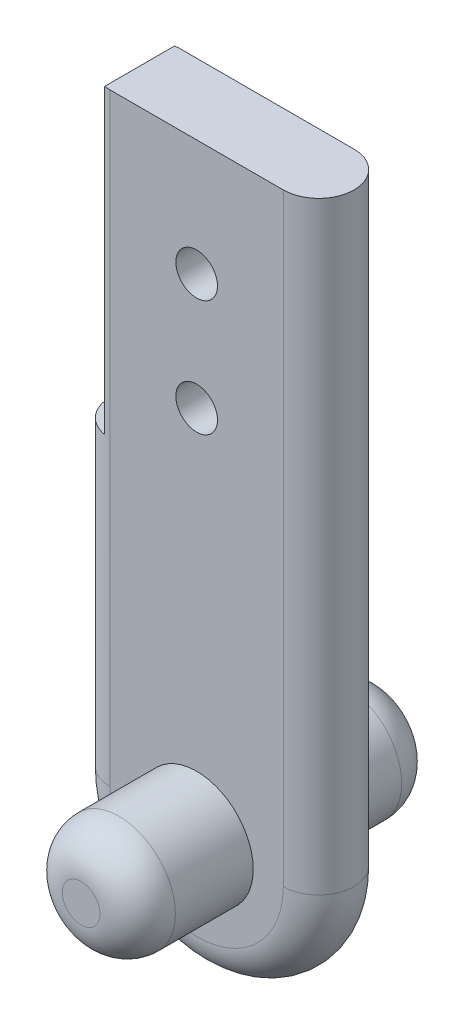
ISO-10303-21;
HEADER;
FILE_DESCRIPTION(('STEP AP214'),'2;1');
FILE_NAME('part.step','',(''),(''),'','','');
FILE_SCHEMA(('AUTOMOTIVE_DESIGN { 1 0 10303 214 1 1 1 1 }'));
ENDSEC;
DATA;
#1=APPLICATION_CONTEXT('core data for automotive mechanical design processes');
#2=APPLICATION_PROTOCOL_DEFINITION('international standard','automotive_design',2000,#1);
#3=PRODUCT_CONTEXT('',#1,'mechanical');
#4=PRODUCT('Part','Part','',(#3));
#5=PRODUCT_RELATED_PRODUCT_CATEGORY('part','',(#4));
#6=PRODUCT_DEFINITION_FORMATION('','',#4);
#7=PRODUCT_DEFINITION_CONTEXT('part definition',#1,'design');
#8=PRODUCT_DEFINITION('design','',#6,#7);
#9=PRODUCT_DEFINITION_SHAPE('','',#8);
#10=(LENGTH_UNIT() NAMED_UNIT(*) SI_UNIT(.MILLI.,.METRE.));
#11=(NAMED_UNIT(*) PLANE_ANGLE_UNIT() SI_UNIT($,.RADIAN.));
#12=(NAMED_UNIT(*) SI_UNIT($,.STERADIAN.) SOLID_ANGLE_UNIT());
#13=UNCERTAINTY_MEASURE_WITH_UNIT(LENGTH_MEASURE(1.E-05),#10,'distance_accuracy_value','');
#14=(GEOMETRIC_REPRESENTATION_CONTEXT(3) GLOBAL_UNCERTAINTY_ASSIGNED_CONTEXT((#13)) GLOBAL_UNIT_ASSIGNED_CONTEXT((#10,
#11,#12)) REPRESENTATION_CONTEXT('',''));
#15=CARTESIAN_POINT('',(0.,0.,0.));
#16=DIRECTION('',(0.,0.,1.));
#17=DIRECTION('',(1.,0.,0.));
#18=AXIS2_PLACEMENT_3D('',#15,#16,#17);
#19=CARTESIAN_POINT('',(44.846875,0.,0.));
#20=DIRECTION('',(0.,0.,1.));
#21=DIRECTION('',(1.,0.,0.));
#22=AXIS2_PLACEMENT_3D('',#19,#20,#21);
#23=TOROIDAL_SURFACE('',#22,7.29795332856184,2.9765625);
#24=CARTESIAN_POINT('',(52.1448283285618,0.,0.));
#25=DIRECTION('',(0.,1.,0.));
#26=DIRECTION('',(0.,0.,1.));
#27=AXIS2_PLACEMENT_3D('',#24,#25,#26);
#28=CIRCLE('',#27,2.9765625);
#29=CARTESIAN_POINT('',(52.1448283285618,0.,2.9765625));
#30=VERTEX_POINT('',#29);
#31=CARTESIAN_POINT('',(52.1448283285618,0.,-2.9765625));
#32=VERTEX_POINT('',#31);
#33=EDGE_CURVE('E93',#30,#32,#28,.T.);
#34=ORIENTED_EDGE('',*,*,#33,.F.);
#35=CARTESIAN_POINT('',(44.846875,0.,2.9765625));
#36=DIRECTION('',(0.,0.,1.));
#37=DIRECTION('',(1.,0.,0.));
#38=AXIS2_PLACEMENT_3D('',#35,#36,#37);
#39=CIRCLE('',#38,7.29795332856184);
#40=CARTESIAN_POINT('',(37.5489216714382,0.,2.9765625));
#41=VERTEX_POINT('',#40);
#42=EDGE_CURVE('E168',#41,#30,#39,.T.);
#43=ORIENTED_EDGE('',*,*,#42,.F.);
#44=CARTESIAN_POINT('',(37.5489216714382,0.,2.9765625));
#45=CARTESIAN_POINT('',(37.5002177322397,0.,2.97656353313143));
#46=CARTESIAN_POINT('',(37.4515138809507,0.,2.97536716347409));
#47=CARTESIAN_POINT('',(37.3542234631953,0.,2.97058703674733));
#48=CARTESIAN_POINT('',(37.3056368967289,0.,2.96700327967792));
#49=CARTESIAN_POINT('',(37.208698157623,0.,2.95745579629251));
#50=CARTESIAN_POINT('',(37.1603459849834,0.,2.95149206997651));
#51=CARTESIAN_POINT('',(37.0639925021509,0.,2.93719934090758));
#52=CARTESIAN_POINT('',(37.0159911919579,0.,2.92887033815465));
#53=CARTESIAN_POINT('',(36.9204550776662,0.,2.90986703424584));
#54=CARTESIAN_POINT('',(36.8729202735675,0.,2.89919273308996));
#55=CARTESIAN_POINT('',(36.7784316858222,0.,2.87552457108381));
#56=CARTESIAN_POINT('',(36.7314779021757,0.,2.86253071023353));
#57=CARTESIAN_POINT('',(36.6382644714201,0.,2.83425472592228));
#58=CARTESIAN_POINT('',(36.5920048243111,0.,2.8189726024613));
#59=CARTESIAN_POINT('',(36.5002911100897,0.,2.78615691058137));
#60=CARTESIAN_POINT('',(36.4548370429774,0.,2.76862334216243));
#61=CARTESIAN_POINT('',(36.3648439916005,0.,2.73134699981883));
#62=CARTESIAN_POINT('',(36.320305007336,0.,2.71160422589417));
#63=CARTESIAN_POINT('',(36.2322494199632,0.,2.66995703473133));
#64=CARTESIAN_POINT('',(36.1887328168548,0.,2.64805261749314));
#65=CARTESIAN_POINT('',(36.1028268271043,0.,2.60213490933066));
#66=CARTESIAN_POINT('',(36.0604374404621,0.,2.57812161840637));
#67=CARTESIAN_POINT('',(35.9768880033889,0.,2.5280440130015));
#68=CARTESIAN_POINT('',(35.9357279529579,0.,2.50197969852091));
#69=CARTESIAN_POINT('',(35.8547363464736,0.,2.44786283721768));
#70=CARTESIAN_POINT('',(35.8149047904205,0.,2.41981029039503));
#71=CARTESIAN_POINT('',(35.7366661303993,0.,2.36178454545069));
#72=CARTESIAN_POINT('',(35.6982590264314,0.,2.331811347329));
#73=CARTESIAN_POINT('',(35.6229617966582,0.,2.27001650784604));
#74=CARTESIAN_POINT('',(35.586071670853,0.,2.23819486648477));
#75=CARTESIAN_POINT('',(35.5138972689496,0.,2.17277980164397));
#76=CARTESIAN_POINT('',(35.4786129928514,0.,2.13918637816444));
#77=CARTESIAN_POINT('',(35.4097352932737,0.,2.07030867858672));
#78=CARTESIAN_POINT('',(35.3761418697942,0.,2.03502440248853));
#79=CARTESIAN_POINT('',(35.3107268049534,0.,1.96285000058513));
#80=CARTESIAN_POINT('',(35.2789051635921,0.,1.92595987477993));
#81=CARTESIAN_POINT('',(35.2171103241092,0.,1.85066264500677));
#82=CARTESIAN_POINT('',(35.1871371259874,0.,1.81225554103882));
#83=CARTESIAN_POINT('',(35.1291113810432,0.,1.7340168810177));
#84=CARTESIAN_POINT('',(35.1010588342206,0.,1.69418532496452));
#85=CARTESIAN_POINT('',(35.0469419729171,0.,1.6131937184803));
#86=CARTESIAN_POINT('',(35.0208776584361,0.,1.57203366804926));
#87=CARTESIAN_POINT('',(34.9708000530323,0.,1.48848423097601));
#88=CARTESIAN_POINT('',(34.9467867621095,0.,1.44609484433379));
#89=CARTESIAN_POINT('',(34.9008690539431,0.,1.36018885458348));
#90=CARTESIAN_POINT('',(34.8789646366995,0.,1.31667225147537));
#91=CARTESIAN_POINT('',(34.8373174455513,0.,1.22861666410178));
#92=CARTESIAN_POINT('',(34.8175746716468,0.,1.18407767983628));
#93=CARTESIAN_POINT('',(34.7802983292483,0.,1.09408462846215));
#94=CARTESIAN_POINT('',(34.7627647607543,0.,1.04863056135351));
#95=CARTESIAN_POINT('',(34.7299490690793,0.,0.956916847122055));
#96=CARTESIAN_POINT('',(34.7146669458982,0.,0.910657199999242));
#97=CARTESIAN_POINT('',(34.6863909608223,0.,0.81744376928123));
#98=CARTESIAN_POINT('',(34.6733970989274,0.,0.77048998568603));
#99=CARTESIAN_POINT('',(34.6497289397752,0.,0.676001397800589));
#100=CARTESIAN_POINT('',(34.6390546425179,0.,0.628466593510347));
#101=CARTESIAN_POINT('',(34.620051327958,0.,0.532930479741916));
#102=CARTESIAN_POINT('',(34.6117223106553,0.,0.484929170263727));
#103=CARTESIAN_POINT('',(34.5974296213369,0.,0.38857568547835));
#104=CARTESIAN_POINT('',(34.5914659493212,0.,0.340223510171162));
#105=CARTESIAN_POINT('',(34.5819183175847,0.,0.243284778353254));
#106=CARTESIAN_POINT('',(34.5783343578641,0.,0.194698221842534));
#107=CARTESIAN_POINT('',(34.5735547847908,0.,0.0974077768878763));
#108=CARTESIAN_POINT('',(34.5723591714382,0.,0.0487038884439382));
#109=CARTESIAN_POINT('',(34.5723591714382,0.,-0.0487038884439382));
#110=CARTESIAN_POINT('',(34.5735547847908,0.,-0.0974077768878763));
#111=CARTESIAN_POINT('',(34.5783343578641,0.,-0.194698221842534));
#112=CARTESIAN_POINT('',(34.5819183175847,0.,-0.243284778353254));
#113=CARTESIAN_POINT('',(34.5914659493212,0.,-0.340223510171162));
#114=CARTESIAN_POINT('',(34.5974296213369,0.,-0.38857568547835));
#115=CARTESIAN_POINT('',(34.6117223106553,0.,-0.484929170263727));
#116=CARTESIAN_POINT('',(34.620051327958,0.,-0.532930479741916));
#117=CARTESIAN_POINT('',(34.6390546425179,0.,-0.628466593510347));
#118=CARTESIAN_POINT('',(34.6497289397752,0.,-0.676001397800589));
#119=CARTESIAN_POINT('',(34.6733970989274,0.,-0.77048998568603));
#120=CARTESIAN_POINT('',(34.6863909608223,0.,-0.81744376928123));
#121=CARTESIAN_POINT('',(34.7146669458982,0.,-0.910657199999242));
#122=CARTESIAN_POINT('',(34.7299490690793,0.,-0.956916847122055));
#123=CARTESIAN_POINT('',(34.7627647607543,0.,-1.04863056135351));
#124=CARTESIAN_POINT('',(34.7802983292483,0.,-1.09408462846215));
#125=CARTESIAN_POINT('',(34.8175746716468,0.,-1.18407767983628));
#126=CARTESIAN_POINT('',(34.8373174455513,0.,-1.22861666410178));
#127=CARTESIAN_POINT('',(34.8789646366995,0.,-1.31667225147537));
#128=CARTESIAN_POINT('',(34.9008690539431,0.,-1.36018885458348));
#129=CARTESIAN_POINT('',(34.9467867621095,0.,-1.44609484433379));
#130=CARTESIAN_POINT('',(34.9708000530323,0.,-1.48848423097601));
#131=CARTESIAN_POINT('',(35.0208776584361,0.,-1.57203366804926));
#132=CARTESIAN_POINT('',(35.0469419729171,0.,-1.6131937184803));
#133=CARTESIAN_POINT('',(35.1010588342206,0.,-1.69418532496452));
#134=CARTESIAN_POINT('',(35.1291113810432,0.,-1.7340168810177));
#135=CARTESIAN_POINT('',(35.1871371259874,0.,-1.81225554103882));
#136=CARTESIAN_POINT('',(35.2171103241092,0.,-1.85066264500677));
#137=CARTESIAN_POINT('',(35.2789051635921,0.,-1.92595987477993));
#138=CARTESIAN_POINT('',(35.3107268049534,0.,-1.96285000058513));
#139=CARTESIAN_POINT('',(35.3761418697942,0.,-2.03502440248853));
#140=CARTESIAN_POINT('',(35.4097352932737,0.,-2.07030867858672));
#141=CARTESIAN_POINT('',(35.4786129928514,0.,-2.13918637816444));
#142=CARTESIAN_POINT('',(35.5138972689496,0.,-2.17277980164397));
#143=CARTESIAN_POINT('',(35.586071670853,0.,-2.23819486648477));
#144=CARTESIAN_POINT('',(35.6229617966582,0.,-2.27001650784604));
#145=CARTESIAN_POINT('',(35.6982590264314,0.,-2.331811347329));
#146=CARTESIAN_POINT('',(35.7366661303993,0.,-2.36178454545069));
#147=CARTESIAN_POINT('',(35.8149047904205,0.,-2.41981029039503));
#148=CARTESIAN_POINT('',(35.8547363464736,0.,-2.44786283721768));
#149=CARTESIAN_POINT('',(35.9357279529579,0.,-2.50197969852091));
#150=CARTESIAN_POINT('',(35.9768880033889,0.,-2.5280440130015));
#151=CARTESIAN_POINT('',(36.0604374404621,0.,-2.57812161840637));
#152=CARTESIAN_POINT('',(36.1028268271043,0.,-2.60213490933066));
#153=CARTESIAN_POINT('',(36.1887328168548,0.,-2.64805261749314));
#154=CARTESIAN_POINT('',(36.2322494199632,0.,-2.66995703473133));
#155=CARTESIAN_POINT('',(36.320305007336,0.,-2.71160422589417));
#156=CARTESIAN_POINT('',(36.3648439916005,0.,-2.73134699981883));
#157=CARTESIAN_POINT('',(36.4548370429774,0.,-2.76862334216243));
#158=CARTESIAN_POINT('',(36.5002911100897,0.,-2.78615691058137));
#159=CARTESIAN_POINT('',(36.5920048243111,0.,-2.8189726024613));
#160=CARTESIAN_POINT('',(36.6382644714201,0.,-2.83425472592228));
#161=CARTESIAN_POINT('',(36.7314779021757,0.,-2.86253071023353));
#162=CARTESIAN_POINT('',(36.7784316858222,0.,-2.87552457108381));
#163=CARTESIAN_POINT('',(36.8729202735675,0.,-2.89919273308996));
#164=CARTESIAN_POINT('',(36.9204550776662,0.,-2.90986703424584));
#165=CARTESIAN_POINT('',(37.0159911919579,0.,-2.92887033815465));
#166=CARTESIAN_POINT('',(37.0639925021509,0.,-2.93719934090758));
#167=CARTESIAN_POINT('',(37.1603459849834,0.,-2.95149206997651));
#168=CARTESIAN_POINT('',(37.208698157623,0.,-2.95745579629251));
#169=CARTESIAN_POINT('',(37.3056368967289,0.,-2.96700327967792));
#170=CARTESIAN_POINT('',(37.3542234631953,0.,-2.97058703674733));
#171=CARTESIAN_POINT('',(37.4515138809507,0.,-2.97536716347409));
#172=CARTESIAN_POINT('',(37.5002177322397,0.,-2.97656353313143));
#173=CARTESIAN_POINT('',(37.5489216714382,0.,-2.9765625));
#174=B_SPLINE_CURVE_WITH_KNOTS('',3,(#44,#45,#46,#47,#48,#49,#50,#51,#52,#53,#54,#55,#56,#57,
#58,#59,#60,#61,#62,#63,#64,#65,#66,#67,#68,#69,#70,#71,#72,#73,#74,#75,#76,#77,#78,#79,#80,#81,
#82,#83,#84,#85,#86,#87,#88,#89,#90,#91,#92,#93,#94,#95,#96,#97,#98,#99,#100,#101,#102,#103,
#104,#105,#106,#107,#108,#109,#110,#111,#112,#113,#114,#115,#116,#117,#118,#119,#120,#121,#122,
#123,#124,#125,#126,#127,#128,#129,#130,#131,#132,#133,#134,#135,#136,#137,#138,#139,#140,#141,
#142,#143,#144,#145,#146,#147,#148,#149,#150,#151,#152,#153,#154,#155,#156,#157,#158,#159,#160,
#161,#162,#163,#164,#165,#166,#167,#168,#169,#170,#171,#172,#173),.UNSPECIFIED.,.F.,.F.,(4,2,2,
2,2,2,2,2,2,2,2,2,2,2,2,2,2,2,2,2,2,2,2,2,2,2,2,2,2,2,2,2,2,2,2,2,2,2,2,2,2,2,2,2,2,2,2,2,2,2,2,
2,2,2,2,2,2,2,2,2,2,2,2,2,4),(0.,0.146097001050459,0.292194002100921,0.438291003151385,
0.584388004201847,0.730485005252315,0.876582006302773,1.02267900735323,1.1687760084037,
1.31487300945416,1.46097001050462,1.60706701155509,1.75316401260555,1.89926101365601,
2.04535801470647,2.19145501575693,2.3375520168074,2.48364901785786,2.62974601890832,
2.77584301995879,2.92194002100924,3.06803702205971,3.21413402311017,3.36023102416063,
3.50632802521109,3.65242502626156,3.79852202731202,3.94461902836248,4.09071602941294,
4.23681303046341,4.38291003151387,4.52900703256433,4.67510403361479,4.82120103466526,
4.96729803571572,5.11339503676618,5.25949203781664,5.40558903886711,5.55168603991757,
5.69778304096803,5.84388004201849,5.98997704306896,6.13607404411942,6.28217104516988,
6.42826804622034,6.5743650472708,6.72046204832127,6.86655904937173,7.01265605042219,
7.15875305147266,7.30485005252312,7.45094705357358,7.59704405462404,7.7431410556745,
7.88923805672497,8.03533505777543,8.18143205882589,8.32752905987636,8.47362606092682,
8.61972306197727,8.76582006302774,8.9119170640782,9.05801406512867,9.20411106617913,
9.35020806722959),.UNSPECIFIED.);
#175=CARTESIAN_POINT('',(37.5489216714382,0.,-2.9765625));
#176=VERTEX_POINT('',#175);
#177=EDGE_CURVE('E56',#41,#176,#174,.T.);
#178=ORIENTED_EDGE('',*,*,#177,.T.);
#179=CARTESIAN_POINT('',(44.846875,0.,-2.9765625));
#180=DIRECTION('',(0.,0.,1.));
#181=DIRECTION('',(1.,0.,0.));
#182=AXIS2_PLACEMENT_3D('',#179,#180,#181);
#183=CIRCLE('',#182,7.29795332856184);
#184=EDGE_CURVE('E159',#32,#176,#183,.F.);
#185=ORIENTED_EDGE('',*,*,#184,.F.);
#186=EDGE_LOOP('',(#34,#43,#178,#185));
#187=FACE_BOUND('',#186,.T.);
#188=ADVANCED_FACE('F32',(#187),#23,.T.);
#189=CARTESIAN_POINT('',(37.5489216714382,50.8,0.));
#190=DIRECTION('',(0.,-1.,0.));
#191=DIRECTION('',(0.,0.,-1.));
#192=AXIS2_PLACEMENT_3D('',#189,#190,#191);
#193=CYLINDRICAL_SURFACE('',#192,2.9765625);
#194=DIRECTION('',(0.,-1.,0.));
#195=VECTOR('',#194,1.);
#196=CARTESIAN_POINT('',(37.068125,50.8,2.9374749151508));
#197=LINE('',#196,#195);
#198=CARTESIAN_POINT('',(37.068125,25.4,2.9374749151508));
#199=VERTEX_POINT('',#198);
#200=CARTESIAN_POINT('',(37.068125,50.8,2.9374749151508));
#201=VERTEX_POINT('',#200);
#202=EDGE_CURVE('E48',#199,#201,#197,.F.);
#203=ORIENTED_EDGE('',*,*,#202,.F.);
#204=CARTESIAN_POINT('',(37.5489216714382,25.4,0.));
#205=DIRECTION('',(0.,1.,0.));
#206=DIRECTION('',(0.,0.,1.));
#207=AXIS2_PLACEMENT_3D('',#204,#205,#206);
#208=CIRCLE('',#207,2.9765625);
#209=CARTESIAN_POINT('',(37.068125,25.4,-2.9374749151508));
#210=VERTEX_POINT('',#209);
#211=EDGE_CURVE('E11',#199,#210,#208,.F.);
#212=ORIENTED_EDGE('',*,*,#211,.T.);
#213=DIRECTION('',(0.,-1.,0.));
#214=VECTOR('',#213,1.);
#215=CARTESIAN_POINT('',(37.068125,50.8,-2.9374749151508));
#216=LINE('',#215,#214);
#217=CARTESIAN_POINT('',(37.068125,50.8,-2.9374749151508));
#218=VERTEX_POINT('',#217);
#219=EDGE_CURVE('E88',#218,#210,#216,.T.);
#220=ORIENTED_EDGE('',*,*,#219,.F.);
#221=CARTESIAN_POINT('',(37.5489216714382,50.8,0.));
#222=DIRECTION('',(0.,-1.,0.));
#223=DIRECTION('',(0.,0.,-1.));
#224=AXIS2_PLACEMENT_3D('',#221,#222,#223);
#225=CIRCLE('',#224,2.9765625);
#226=CARTESIAN_POINT('',(37.5489216714382,50.8,-2.9765625));
#227=VERTEX_POINT('',#226);
#228=EDGE_CURVE('E96',#227,#218,#225,.F.);
#229=ORIENTED_EDGE('',*,*,#228,.F.);
#230=DIRECTION('',(0.,-1.,0.));
#231=VECTOR('',#230,1.);
#232=CARTESIAN_POINT('',(37.5489216714382,0.,-2.9765625));
#233=LINE('',#232,#231);
#234=EDGE_CURVE('E161',#176,#227,#233,.F.);
#235=ORIENTED_EDGE('',*,*,#234,.F.);
#236=ORIENTED_EDGE('',*,*,#177,.F.);
#237=DIRECTION('',(0.,1.,0.));
#238=VECTOR('',#237,1.);
#239=CARTESIAN_POINT('',(37.5489216714382,50.8,2.9765625));
#240=LINE('',#239,#238);
#241=CARTESIAN_POINT('',(37.5489216714382,50.8,2.9765625));
#242=VERTEX_POINT('',#241);
#243=EDGE_CURVE('E165',#242,#41,#240,.F.);
#244=ORIENTED_EDGE('',*,*,#243,.F.);
#245=EDGE_CURVE('E104',#201,#242,#225,.F.);
#246=ORIENTED_EDGE('',*,*,#245,.F.);
#247=EDGE_LOOP('',(#203,#212,#220,#229,#235,#236,#244,#246));
#248=FACE_BOUND('',#247,.T.);
#249=ADVANCED_FACE('F95',(#248),#193,.T.);
#250=CARTESIAN_POINT('',(52.1448283285618,0.,0.));
#251=DIRECTION('',(0.,1.,0.));
#252=DIRECTION('',(-1.,0.,0.));
#253=AXIS2_PLACEMENT_3D('',#250,#251,#252);
#254=CYLINDRICAL_SURFACE('',#253,2.9765625);
#255=DIRECTION('',(0.,-1.,0.));
#256=VECTOR('',#255,1.);
#257=CARTESIAN_POINT('',(52.1448283285618,0.,2.9765625));
#258=LINE('',#257,#256);
#259=CARTESIAN_POINT('',(52.1448283285618,50.8,2.9765625));
#260=VERTEX_POINT('',#259);
#261=EDGE_CURVE('E157',#30,#260,#258,.F.);
#262=ORIENTED_EDGE('',*,*,#261,.F.);
#263=ORIENTED_EDGE('',*,*,#33,.T.);
#264=DIRECTION('',(0.,1.,0.));
#265=VECTOR('',#264,1.);
#266=CARTESIAN_POINT('',(52.1448283285618,0.,-2.9765625));
#267=LINE('',#266,#265);
#268=CARTESIAN_POINT('',(52.1448283285618,50.8,-2.9765625));
#269=VERTEX_POINT('',#268);
#270=EDGE_CURVE('E155',#269,#32,#267,.F.);
#271=ORIENTED_EDGE('',*,*,#270,.F.);
#272=CARTESIAN_POINT('',(52.1448283285618,50.8,0.));
#273=DIRECTION('',(0.,-1.,0.));
#274=DIRECTION('',(0.,0.,-1.));
#275=AXIS2_PLACEMENT_3D('',#272,#273,#274);
#276=CIRCLE('',#275,2.9765625);
#277=EDGE_CURVE('E106',#260,#269,#276,.F.);
#278=ORIENTED_EDGE('',*,*,#277,.F.);
#279=EDGE_LOOP('',(#262,#263,#271,#278));
#280=FACE_BOUND('',#279,.T.);
#281=ADVANCED_FACE('F34',(#280),#254,.T.);
#282=CARTESIAN_POINT('',(44.846875,0.,2.9765625));
#283=DIRECTION('',(0.,0.,1.));
#284=DIRECTION('',(1.,0.,0.));
#285=AXIS2_PLACEMENT_3D('',#282,#283,#284);
#286=PLANE('',#285);
#287=CARTESIAN_POINT('',(44.846875,41.021,2.9765625));
#288=DIRECTION('',(0.,0.,1.));
#289=DIRECTION('',(1.,0.,0.));
#290=AXIS2_PLACEMENT_3D('',#287,#288,#289);
#291=CIRCLE('',#290,1.75259999999999);
#292=CARTESIAN_POINT('',(46.599475,41.021,2.9765625));
#293=VERTEX_POINT('',#292);
#294=EDGE_CURVE('E219',#293,#293,#291,.T.);
#295=ORIENTED_EDGE('',*,*,#294,.F.);
#296=EDGE_LOOP('',(#295));
#297=FACE_BOUND('',#296,.T.);
#298=CARTESIAN_POINT('',(44.846875,31.242,2.9765625));
#299=DIRECTION('',(0.,0.,1.));
#300=DIRECTION('',(1.,0.,0.));
#301=AXIS2_PLACEMENT_3D('',#298,#299,#300);
#302=CIRCLE('',#301,1.75259999999999);
#303=CARTESIAN_POINT('',(46.599475,31.242,2.9765625));
#304=VERTEX_POINT('',#303);
#305=EDGE_CURVE('E213',#304,#304,#302,.T.);
#306=ORIENTED_EDGE('',*,*,#305,.F.);
#307=EDGE_LOOP('',(#306));
#308=FACE_BOUND('',#307,.T.);
#309=DIRECTION('',(-1.,0.,0.));
#310=VECTOR('',#309,1.);
#311=CARTESIAN_POINT('',(34.5723591714382,50.8,2.9765625));
#312=LINE('',#311,#310);
#313=EDGE_CURVE('E180',#260,#242,#312,.T.);
#314=ORIENTED_EDGE('',*,*,#313,.T.);
#315=ORIENTED_EDGE('',*,*,#243,.T.);
#316=ORIENTED_EDGE('',*,*,#42,.T.);
#317=ORIENTED_EDGE('',*,*,#261,.T.);
#318=EDGE_LOOP('',(#314,#315,#316,#317));
#319=FACE_BOUND('',#318,.T.);
#320=CARTESIAN_POINT('',(44.846875,0.,2.9765625));
#321=DIRECTION('',(0.,0.,1.));
#322=DIRECTION('',(1.,0.,0.));
#323=AXIS2_PLACEMENT_3D('',#320,#321,#322);
#324=CIRCLE('',#323,4.7625);
#325=CARTESIAN_POINT('',(49.609375,0.,2.9765625));
#326=VERTEX_POINT('',#325);
#327=EDGE_CURVE('E207',#326,#326,#324,.F.);
#328=ORIENTED_EDGE('',*,*,#327,.T.);
#329=EDGE_LOOP('',(#328));
#330=FACE_BOUND('',#329,.T.);
#331=ADVANCED_FACE('F182',(#297,#308,#319,#330),#286,.T.);
#332=CARTESIAN_POINT('',(44.846875,0.,-2.9765625));
#333=DIRECTION('',(0.,0.,1.));
#334=DIRECTION('',(1.,0.,0.));
#335=AXIS2_PLACEMENT_3D('',#332,#333,#334);
#336=PLANE('',#335);
#337=CARTESIAN_POINT('',(44.846875,41.021,-2.9765625));
#338=DIRECTION('',(0.,0.,-1.));
#339=DIRECTION('',(-1.,0.,0.));
#340=AXIS2_PLACEMENT_3D('',#337,#338,#339);
#341=CIRCLE('',#340,1.75259999999999);
#342=CARTESIAN_POINT('',(43.094275,41.021,-2.9765625));
#343=VERTEX_POINT('',#342);
#344=EDGE_CURVE('E222',#343,#343,#341,.T.);
#345=ORIENTED_EDGE('',*,*,#344,.F.);
#346=EDGE_LOOP('',(#345));
#347=FACE_BOUND('',#346,.T.);
#348=CARTESIAN_POINT('',(44.846875,31.242,-2.9765625));
#349=DIRECTION('',(0.,0.,-1.));
#350=DIRECTION('',(-1.,0.,0.));
#351=AXIS2_PLACEMENT_3D('',#348,#349,#350);
#352=CIRCLE('',#351,1.75259999999999);
#353=CARTESIAN_POINT('',(43.094275,31.242,-2.9765625));
#354=VERTEX_POINT('',#353);
#355=EDGE_CURVE('E216',#354,#354,#352,.T.);
#356=ORIENTED_EDGE('',*,*,#355,.F.);
#357=EDGE_LOOP('',(#356));
#358=FACE_BOUND('',#357,.T.);
#359=ORIENTED_EDGE('',*,*,#184,.T.);
#360=ORIENTED_EDGE('',*,*,#234,.T.);
#361=DIRECTION('',(-1.,0.,0.));
#362=VECTOR('',#361,1.);
#363=CARTESIAN_POINT('',(34.5723591714382,50.8,-2.9765625));
#364=LINE('',#363,#362);
#365=EDGE_CURVE('E103',#269,#227,#364,.T.);
#366=ORIENTED_EDGE('',*,*,#365,.F.);
#367=ORIENTED_EDGE('',*,*,#270,.T.);
#368=EDGE_LOOP('',(#359,#360,#366,#367));
#369=FACE_BOUND('',#368,.T.);
#370=CARTESIAN_POINT('',(44.846875,0.,-2.9765625));
#371=DIRECTION('',(0.,0.,1.));
#372=DIRECTION('',(1.,0.,0.));
#373=AXIS2_PLACEMENT_3D('',#370,#371,#372);
#374=CIRCLE('',#373,4.7625);
#375=CARTESIAN_POINT('',(49.609375,0.,-2.9765625));
#376=VERTEX_POINT('',#375);
#377=EDGE_CURVE('E203',#376,#376,#374,.F.);
#378=ORIENTED_EDGE('',*,*,#377,.F.);
#379=EDGE_LOOP('',(#378));
#380=FACE_BOUND('',#379,.T.);
#381=ADVANCED_FACE('F163',(#347,#358,#369,#380),#336,.F.);
#382=CARTESIAN_POINT('',(34.5723591714382,50.8,2.9765625));
#383=DIRECTION('',(0.,-1.,0.));
#384=DIRECTION('',(0.,0.,-1.));
#385=AXIS2_PLACEMENT_3D('',#382,#383,#384);
#386=PLANE('',#385);
#387=ORIENTED_EDGE('',*,*,#228,.T.);
#388=DIRECTION('',(0.,0.,1.));
#389=VECTOR('',#388,1.);
#390=CARTESIAN_POINT('',(37.068125,50.8,2.9765625));
#391=LINE('',#390,#389);
#392=EDGE_CURVE('E41',#218,#201,#391,.T.);
#393=ORIENTED_EDGE('',*,*,#392,.T.);
#394=ORIENTED_EDGE('',*,*,#245,.T.);
#395=ORIENTED_EDGE('',*,*,#313,.F.);
#396=ORIENTED_EDGE('',*,*,#277,.T.);
#397=ORIENTED_EDGE('',*,*,#365,.T.);
#398=EDGE_LOOP('',(#387,#393,#394,#395,#396,#397));
#399=FACE_BOUND('',#398,.T.);
#400=ADVANCED_FACE('F101',(#399),#386,.F.);
#401=CARTESIAN_POINT('',(44.846875,0.,-12.7));
#402=DIRECTION('',(0.,0.,1.));
#403=DIRECTION('',(1.,0.,0.));
#404=AXIS2_PLACEMENT_3D('',#401,#402,#403);
#405=PLANE('',#404);
#406=CARTESIAN_POINT('',(44.846875,0.,-12.7));
#407=DIRECTION('',(0.,0.,1.));
#408=DIRECTION('',(1.,0.,0.));
#409=AXIS2_PLACEMENT_3D('',#406,#407,#408);
#410=CIRCLE('',#409,1.5875);
#411=CARTESIAN_POINT('',(46.434375,0.,-12.7));
#412=VERTEX_POINT('',#411);
#413=EDGE_CURVE('E197',#412,#412,#410,.F.);
#414=ORIENTED_EDGE('',*,*,#413,.T.);
#415=EDGE_LOOP('',(#414));
#416=FACE_BOUND('',#415,.T.);
#417=ADVANCED_FACE('F256',(#416),#405,.F.);
#418=CARTESIAN_POINT('',(44.846875,0.,12.7));
#419=DIRECTION('',(0.,0.,-1.));
#420=DIRECTION('',(-1.,0.,0.));
#421=AXIS2_PLACEMENT_3D('',#418,#419,#420);
#422=CYLINDRICAL_SURFACE('',#421,4.7625);
#423=CARTESIAN_POINT('',(44.846875,0.,-9.525));
#424=DIRECTION('',(0.,0.,1.));
#425=DIRECTION('',(1.,0.,0.));
#426=AXIS2_PLACEMENT_3D('',#423,#424,#425);
#427=CIRCLE('',#426,4.7625);
#428=CARTESIAN_POINT('',(49.609375,0.,-9.525));
#429=VERTEX_POINT('',#428);
#430=EDGE_CURVE('E200',#429,#429,#427,.T.);
#431=ORIENTED_EDGE('',*,*,#430,.T.);
#432=EDGE_LOOP('',(#431));
#433=FACE_BOUND('',#432,.T.);
#434=ORIENTED_EDGE('',*,*,#377,.T.);
#435=EDGE_LOOP('',(#434));
#436=FACE_BOUND('',#435,.T.);
#437=ADVANCED_FACE('F259',(#433,#436),#422,.T.);
#438=CARTESIAN_POINT('',(44.846875,0.,9.525));
#439=DIRECTION('',(0.,0.,1.));
#440=DIRECTION('',(1.,0.,0.));
#441=AXIS2_PLACEMENT_3D('',#438,#439,#440);
#442=CIRCLE('',#441,4.7625);
#443=CARTESIAN_POINT('',(49.609375,0.,9.525));
#444=VERTEX_POINT('',#443);
#445=EDGE_CURVE('E184',#444,#444,#442,.F.);
#446=ORIENTED_EDGE('',*,*,#445,.T.);
#447=EDGE_LOOP('',(#446));
#448=FACE_BOUND('',#447,.T.);
#449=ORIENTED_EDGE('',*,*,#327,.F.);
#450=EDGE_LOOP('',(#449));
#451=FACE_BOUND('',#450,.T.);
#452=ADVANCED_FACE('F254',(#448,#451),#422,.T.);
#453=CARTESIAN_POINT('',(44.846875,0.,12.7));
#454=DIRECTION('',(0.,0.,1.));
#455=DIRECTION('',(1.,0.,0.));
#456=AXIS2_PLACEMENT_3D('',#453,#454,#455);
#457=PLANE('',#456);
#458=CARTESIAN_POINT('',(44.846875,0.,12.7));
#459=DIRECTION('',(0.,0.,1.));
#460=DIRECTION('',(1.,0.,0.));
#461=AXIS2_PLACEMENT_3D('',#458,#459,#460);
#462=CIRCLE('',#461,1.5875);
#463=CARTESIAN_POINT('',(46.434375,0.,12.7));
#464=VERTEX_POINT('',#463);
#465=EDGE_CURVE('E188',#464,#464,#462,.T.);
#466=ORIENTED_EDGE('',*,*,#465,.T.);
#467=EDGE_LOOP('',(#466));
#468=FACE_BOUND('',#467,.T.);
#469=ADVANCED_FACE('F250',(#468),#457,.T.);
#470=CARTESIAN_POINT('',(44.846875,0.,-9.525));
#471=DIRECTION('',(0.,0.,1.));
#472=DIRECTION('',(1.,0.,0.));
#473=AXIS2_PLACEMENT_3D('',#470,#471,#472);
#474=DEGENERATE_TOROIDAL_SURFACE('',#473,1.5875,3.175,.T.);
#475=ORIENTED_EDGE('',*,*,#413,.F.);
#476=EDGE_LOOP('',(#475));
#477=FACE_BOUND('',#476,.T.);
#478=ORIENTED_EDGE('',*,*,#430,.F.);
#479=EDGE_LOOP('',(#478));
#480=FACE_BOUND('',#479,.T.);
#481=ADVANCED_FACE('F253',(#477,#480),#474,.T.);
#482=CARTESIAN_POINT('',(44.846875,0.,9.525));
#483=DIRECTION('',(0.,0.,1.));
#484=DIRECTION('',(1.,0.,0.));
#485=AXIS2_PLACEMENT_3D('',#482,#483,#484);
#486=DEGENERATE_TOROIDAL_SURFACE('',#485,1.5875,3.175,.T.);
#487=ORIENTED_EDGE('',*,*,#445,.F.);
#488=EDGE_LOOP('',(#487));
#489=FACE_BOUND('',#488,.T.);
#490=ORIENTED_EDGE('',*,*,#465,.F.);
#491=EDGE_LOOP('',(#490));
#492=FACE_BOUND('',#491,.T.);
#493=ADVANCED_FACE('F249',(#489,#492),#486,.T.);
#494=CARTESIAN_POINT('',(37.068125,25.4,2.9765625));
#495=DIRECTION('',(1.,0.,0.));
#496=DIRECTION('',(0.,0.,-1.));
#497=AXIS2_PLACEMENT_3D('',#494,#495,#496);
#498=PLANE('',#497);
#499=ORIENTED_EDGE('',*,*,#202,.T.);
#500=ORIENTED_EDGE('',*,*,#392,.F.);
#501=ORIENTED_EDGE('',*,*,#219,.T.);
#502=DIRECTION('',(0.,0.,-1.));
#503=VECTOR('',#502,1.);
#504=CARTESIAN_POINT('',(37.068125,25.4,2.9765625));
#505=LINE('',#504,#503);
#506=EDGE_CURVE('E98',#199,#210,#505,.T.);
#507=ORIENTED_EDGE('',*,*,#506,.F.);
#508=EDGE_LOOP('',(#499,#500,#501,#507));
#509=FACE_BOUND('',#508,.T.);
#510=ADVANCED_FACE('F87',(#509),#498,.F.);
#511=CARTESIAN_POINT('',(0.,25.4,0.));
#512=DIRECTION('',(0.,1.,0.));
#513=DIRECTION('',(0.,0.,1.));
#514=AXIS2_PLACEMENT_3D('',#511,#512,#513);
#515=PLANE('',#514);
#516=ORIENTED_EDGE('',*,*,#506,.T.);
#517=ORIENTED_EDGE('',*,*,#211,.F.);
#518=EDGE_LOOP('',(#516,#517));
#519=FACE_BOUND('',#518,.T.);
#520=ADVANCED_FACE('F235',(#519),#515,.T.);
#521=CARTESIAN_POINT('',(44.846875,31.242,-2.9765625));
#522=DIRECTION('',(0.,0.,-1.));
#523=DIRECTION('',(-1.,0.,0.));
#524=AXIS2_PLACEMENT_3D('',#521,#522,#523);
#525=CYLINDRICAL_SURFACE('',#524,1.75259999999999);
#526=ORIENTED_EDGE('',*,*,#305,.T.);
#527=EDGE_LOOP('',(#526));
#528=FACE_BOUND('',#527,.T.);
#529=ORIENTED_EDGE('',*,*,#355,.T.);
#530=EDGE_LOOP('',(#529));
#531=FACE_BOUND('',#530,.T.);
#532=ADVANCED_FACE('F233',(#528,#531),#525,.F.);
#533=CARTESIAN_POINT('',(44.846875,41.021,-2.9765625));
#534=DIRECTION('',(0.,0.,-1.));
#535=DIRECTION('',(-1.,0.,0.));
#536=AXIS2_PLACEMENT_3D('',#533,#534,#535);
#537=CYLINDRICAL_SURFACE('',#536,1.75259999999999);
#538=ORIENTED_EDGE('',*,*,#294,.T.);
#539=EDGE_LOOP('',(#538));
#540=FACE_BOUND('',#539,.T.);
#541=ORIENTED_EDGE('',*,*,#344,.T.);
#542=EDGE_LOOP('',(#541));
#543=FACE_BOUND('',#542,.T.);
#544=ADVANCED_FACE('F226',(#540,#543),#537,.F.);
#545=CLOSED_SHELL('',(#188,#249,#281,#331,#381,#400,#417,#437,#452,#469,#481,#493,#510,#520,
#532,#544));
#546=MANIFOLD_SOLID_BREP('B2',#545);
#547=ADVANCED_BREP_SHAPE_REPRESENTATION('',(#18,#546),#14);
#548=SHAPE_DEFINITION_REPRESENTATION(#9,#547);
ENDSEC;
END-ISO-10303-21;
